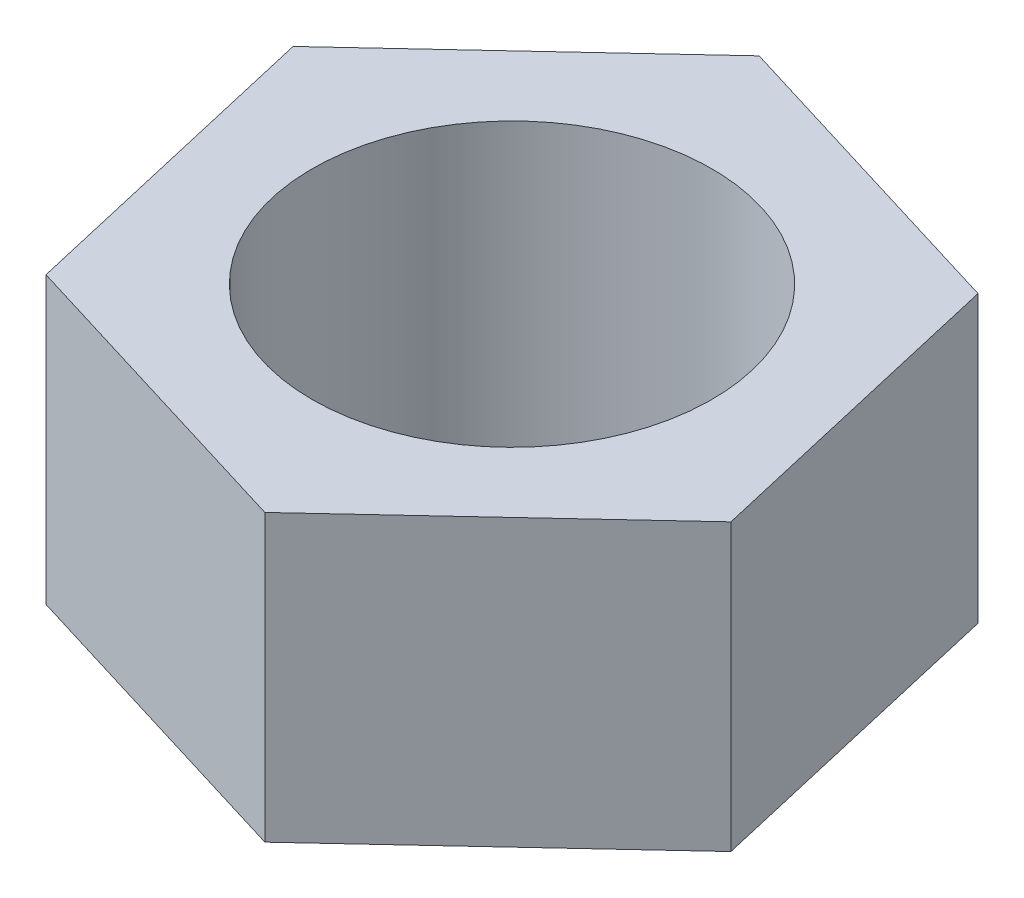
ISO-10303-21;
HEADER;
FILE_DESCRIPTION(('STEP AP214'),'2;1');
FILE_NAME('part.step','',(''),(''),'','','');
FILE_SCHEMA(('AUTOMOTIVE_DESIGN { 1 0 10303 214 1 1 1 1 }'));
ENDSEC;
DATA;
#1=APPLICATION_CONTEXT('core data for automotive mechanical design processes');
#2=APPLICATION_PROTOCOL_DEFINITION('international standard','automotive_design',2000,#1);
#3=PRODUCT_CONTEXT('',#1,'mechanical');
#4=PRODUCT('Part','Part','',(#3));
#5=PRODUCT_RELATED_PRODUCT_CATEGORY('part','',(#4));
#6=PRODUCT_DEFINITION_FORMATION('','',#4);
#7=PRODUCT_DEFINITION_CONTEXT('part definition',#1,'design');
#8=PRODUCT_DEFINITION('design','',#6,#7);
#9=PRODUCT_DEFINITION_SHAPE('','',#8);
#10=(LENGTH_UNIT() NAMED_UNIT(*) SI_UNIT(.MILLI.,.METRE.));
#11=(NAMED_UNIT(*) PLANE_ANGLE_UNIT() SI_UNIT($,.RADIAN.));
#12=(NAMED_UNIT(*) SI_UNIT($,.STERADIAN.) SOLID_ANGLE_UNIT());
#13=UNCERTAINTY_MEASURE_WITH_UNIT(LENGTH_MEASURE(1.E-05),#10,'distance_accuracy_value','');
#14=(GEOMETRIC_REPRESENTATION_CONTEXT(3) GLOBAL_UNCERTAINTY_ASSIGNED_CONTEXT((#13)) GLOBAL_UNIT_ASSIGNED_CONTEXT((#10,
#11,#12)) REPRESENTATION_CONTEXT('',''));
#15=CARTESIAN_POINT('',(0.,0.,0.));
#16=DIRECTION('',(0.,0.,1.));
#17=DIRECTION('',(1.,0.,0.));
#18=AXIS2_PLACEMENT_3D('',#15,#16,#17);
#19=CARTESIAN_POINT('',(2.59645393444764,10.,11.2513003826058));
#20=DIRECTION('',(0.,1.,0.));
#21=DIRECTION('',(0.,0.,1.));
#22=AXIS2_PLACEMENT_3D('',#19,#20,#21);
#23=PLANE('',#22);
#24=DIRECTION('',(0.956277282044818,0.,0.292461552763736));
#25=VECTOR('',#24,1.);
#26=CARTESIAN_POINT('',(-8.44568498972238,10.,7.87424525829061));
#27=LINE('',#26,#25);
#28=CARTESIAN_POINT('',(-8.44568498972238,10.,7.87424525829061));
#29=VERTEX_POINT('',#28);
#30=CARTESIAN_POINT('',(2.59645393444764,10.,11.2513003826058));
#31=VERTEX_POINT('',#30);
#32=EDGE_CURVE('E127',#29,#31,#27,.T.);
#33=ORIENTED_EDGE('',*,*,#32,.T.);
#34=DIRECTION('',(0.731417775346047,0.,-0.681929642930881));
#35=VECTOR('',#34,1.);
#36=CARTESIAN_POINT('',(2.59645393444764,10.,11.2513003826058));
#37=LINE('',#36,#35);
#38=CARTESIAN_POINT('',(11.04213892417,10.,3.37705512431518));
#39=VERTEX_POINT('',#38);
#40=EDGE_CURVE('E85',#31,#39,#37,.T.);
#41=ORIENTED_EDGE('',*,*,#40,.T.);
#42=DIRECTION('',(-0.224859506698771,0.,-0.974391195694617));
#43=VECTOR('',#42,1.);
#44=CARTESIAN_POINT('',(11.04213892417,10.,3.37705512431518));
#45=LINE('',#44,#43);
#46=CARTESIAN_POINT('',(8.44568498972238,10.,-7.87424525829062));
#47=VERTEX_POINT('',#46);
#48=EDGE_CURVE('E98',#39,#47,#45,.T.);
#49=ORIENTED_EDGE('',*,*,#48,.T.);
#50=DIRECTION('',(-0.956277282044818,0.,-0.292461552763736));
#51=VECTOR('',#50,1.);
#52=CARTESIAN_POINT('',(8.44568498972238,10.,-7.87424525829062));
#53=LINE('',#52,#51);
#54=CARTESIAN_POINT('',(-2.59645393444764,10.,-11.2513003826058));
#55=VERTEX_POINT('',#54);
#56=EDGE_CURVE('E92',#47,#55,#53,.T.);
#57=ORIENTED_EDGE('',*,*,#56,.T.);
#58=DIRECTION('',(-0.731417775346047,0.,0.681929642930881));
#59=VECTOR('',#58,1.);
#60=CARTESIAN_POINT('',(-2.59645393444764,10.,-11.2513003826058));
#61=LINE('',#60,#59);
#62=CARTESIAN_POINT('',(-11.04213892417,10.,-3.37705512431519));
#63=VERTEX_POINT('',#62);
#64=EDGE_CURVE('E96',#55,#63,#61,.T.);
#65=ORIENTED_EDGE('',*,*,#64,.T.);
#66=DIRECTION('',(0.224859506698771,0.,0.974391195694617));
#67=VECTOR('',#66,1.);
#68=CARTESIAN_POINT('',(-11.04213892417,10.,-3.37705512431519));
#69=LINE('',#68,#67);
#70=EDGE_CURVE('E48',#63,#29,#69,.T.);
#71=ORIENTED_EDGE('',*,*,#70,.T.);
#72=EDGE_LOOP('',(#33,#41,#49,#57,#65,#71));
#73=FACE_BOUND('',#72,.T.);
#74=CARTESIAN_POINT('',(0.,10.,0.));
#75=DIRECTION('',(0.,1.,0.));
#76=DIRECTION('',(0.,0.,1.));
#77=AXIS2_PLACEMENT_3D('',#74,#75,#76);
#78=CIRCLE('',#77,7.);
#79=CARTESIAN_POINT('',(0.,10.,7.));
#80=VERTEX_POINT('',#79);
#81=EDGE_CURVE('E120',#80,#80,#78,.T.);
#82=ORIENTED_EDGE('',*,*,#81,.F.);
#83=EDGE_LOOP('',(#82));
#84=FACE_BOUND('',#83,.T.);
#85=ADVANCED_FACE('F31',(#73,#84),#23,.T.);
#86=CARTESIAN_POINT('',(2.59645393444764,0.,11.2513003826058));
#87=DIRECTION('',(0.,1.,0.));
#88=DIRECTION('',(0.,0.,1.));
#89=AXIS2_PLACEMENT_3D('',#86,#87,#88);
#90=PLANE('',#89);
#91=DIRECTION('',(0.956277282044818,0.,0.292461552763736));
#92=VECTOR('',#91,1.);
#93=CARTESIAN_POINT('',(-8.44568498972238,0.,7.87424525829061));
#94=LINE('',#93,#92);
#95=CARTESIAN_POINT('',(-8.44568498972238,0.,7.87424525829061));
#96=VERTEX_POINT('',#95);
#97=CARTESIAN_POINT('',(2.59645393444764,0.,11.2513003826058));
#98=VERTEX_POINT('',#97);
#99=EDGE_CURVE('E116',#96,#98,#94,.T.);
#100=ORIENTED_EDGE('',*,*,#99,.F.);
#101=DIRECTION('',(0.224859506698771,0.,0.974391195694617));
#102=VECTOR('',#101,1.);
#103=CARTESIAN_POINT('',(-11.04213892417,0.,-3.37705512431519));
#104=LINE('',#103,#102);
#105=CARTESIAN_POINT('',(-11.04213892417,0.,-3.37705512431519));
#106=VERTEX_POINT('',#105);
#107=EDGE_CURVE('E77',#106,#96,#104,.T.);
#108=ORIENTED_EDGE('',*,*,#107,.F.);
#109=DIRECTION('',(-0.731417775346047,0.,0.681929642930881));
#110=VECTOR('',#109,1.);
#111=CARTESIAN_POINT('',(-2.59645393444764,0.,-11.2513003826058));
#112=LINE('',#111,#110);
#113=CARTESIAN_POINT('',(-2.59645393444764,0.,-11.2513003826058));
#114=VERTEX_POINT('',#113);
#115=EDGE_CURVE('E71',#114,#106,#112,.T.);
#116=ORIENTED_EDGE('',*,*,#115,.F.);
#117=DIRECTION('',(-0.956277282044818,0.,-0.292461552763736));
#118=VECTOR('',#117,1.);
#119=CARTESIAN_POINT('',(8.44568498972238,0.,-7.87424525829062));
#120=LINE('',#119,#118);
#121=CARTESIAN_POINT('',(8.44568498972238,0.,-7.87424525829062));
#122=VERTEX_POINT('',#121);
#123=EDGE_CURVE('E106',#122,#114,#120,.T.);
#124=ORIENTED_EDGE('',*,*,#123,.F.);
#125=DIRECTION('',(-0.224859506698771,0.,-0.974391195694617));
#126=VECTOR('',#125,1.);
#127=CARTESIAN_POINT('',(11.04213892417,0.,3.37705512431518));
#128=LINE('',#127,#126);
#129=CARTESIAN_POINT('',(11.04213892417,0.,3.37705512431518));
#130=VERTEX_POINT('',#129);
#131=EDGE_CURVE('E122',#130,#122,#128,.T.);
#132=ORIENTED_EDGE('',*,*,#131,.F.);
#133=DIRECTION('',(0.731417775346047,0.,-0.681929642930881));
#134=VECTOR('',#133,1.);
#135=CARTESIAN_POINT('',(2.59645393444764,0.,11.2513003826058));
#136=LINE('',#135,#134);
#137=EDGE_CURVE('E119',#98,#130,#136,.T.);
#138=ORIENTED_EDGE('',*,*,#137,.F.);
#139=EDGE_LOOP('',(#100,#108,#116,#124,#132,#138));
#140=FACE_BOUND('',#139,.T.);
#141=CARTESIAN_POINT('',(0.,0.,0.));
#142=DIRECTION('',(0.,1.,0.));
#143=DIRECTION('',(0.,0.,1.));
#144=AXIS2_PLACEMENT_3D('',#141,#142,#143);
#145=CIRCLE('',#144,7.);
#146=CARTESIAN_POINT('',(0.,0.,7.));
#147=VERTEX_POINT('',#146);
#148=EDGE_CURVE('E220',#147,#147,#145,.T.);
#149=ORIENTED_EDGE('',*,*,#148,.T.);
#150=EDGE_LOOP('',(#149));
#151=FACE_BOUND('',#150,.T.);
#152=ADVANCED_FACE('F136',(#140,#151),#90,.F.);
#153=CARTESIAN_POINT('',(-8.44568498972238,10.,7.87424525829061));
#154=DIRECTION('',(0.292461552763736,0.,-0.956277282044818));
#155=DIRECTION('',(-0.956277282044818,0.,-0.292461552763736));
#156=AXIS2_PLACEMENT_3D('',#153,#154,#155);
#157=PLANE('',#156);
#158=ORIENTED_EDGE('',*,*,#99,.T.);
#159=DIRECTION('',(0.,-1.,0.));
#160=VECTOR('',#159,1.);
#161=CARTESIAN_POINT('',(2.59645393444764,10.,11.2513003826058));
#162=LINE('',#161,#160);
#163=EDGE_CURVE('E11',#31,#98,#162,.T.);
#164=ORIENTED_EDGE('',*,*,#163,.F.);
#165=ORIENTED_EDGE('',*,*,#32,.F.);
#166=DIRECTION('',(0.,-1.,0.));
#167=VECTOR('',#166,1.);
#168=CARTESIAN_POINT('',(-8.44568498972238,10.,7.87424525829061));
#169=LINE('',#168,#167);
#170=EDGE_CURVE('E112',#29,#96,#169,.T.);
#171=ORIENTED_EDGE('',*,*,#170,.T.);
#172=EDGE_LOOP('',(#158,#164,#165,#171));
#173=FACE_BOUND('',#172,.T.);
#174=ADVANCED_FACE('F33',(#173),#157,.F.);
#175=CARTESIAN_POINT('',(2.59645393444764,10.,11.2513003826058));
#176=DIRECTION('',(-0.681929642930881,0.,-0.731417775346047));
#177=DIRECTION('',(-0.731417775346047,0.,0.681929642930881));
#178=AXIS2_PLACEMENT_3D('',#175,#176,#177);
#179=PLANE('',#178);
#180=ORIENTED_EDGE('',*,*,#137,.T.);
#181=DIRECTION('',(0.,-1.,0.));
#182=VECTOR('',#181,1.);
#183=CARTESIAN_POINT('',(11.04213892417,10.,3.37705512431518));
#184=LINE('',#183,#182);
#185=EDGE_CURVE('E40',#39,#130,#184,.T.);
#186=ORIENTED_EDGE('',*,*,#185,.F.);
#187=ORIENTED_EDGE('',*,*,#40,.F.);
#188=ORIENTED_EDGE('',*,*,#163,.T.);
#189=EDGE_LOOP('',(#180,#186,#187,#188));
#190=FACE_BOUND('',#189,.T.);
#191=ADVANCED_FACE('F161',(#190),#179,.F.);
#192=CARTESIAN_POINT('',(11.04213892417,10.,3.37705512431518));
#193=DIRECTION('',(-0.974391195694617,0.,0.224859506698771));
#194=DIRECTION('',(0.224859506698771,0.,0.974391195694617));
#195=AXIS2_PLACEMENT_3D('',#192,#193,#194);
#196=PLANE('',#195);
#197=ORIENTED_EDGE('',*,*,#131,.T.);
#198=DIRECTION('',(0.,-1.,0.));
#199=VECTOR('',#198,1.);
#200=CARTESIAN_POINT('',(8.44568498972238,10.,-7.87424525829062));
#201=LINE('',#200,#199);
#202=EDGE_CURVE('E107',#47,#122,#201,.T.);
#203=ORIENTED_EDGE('',*,*,#202,.F.);
#204=ORIENTED_EDGE('',*,*,#48,.F.);
#205=ORIENTED_EDGE('',*,*,#185,.T.);
#206=EDGE_LOOP('',(#197,#203,#204,#205));
#207=FACE_BOUND('',#206,.T.);
#208=ADVANCED_FACE('F133',(#207),#196,.F.);
#209=CARTESIAN_POINT('',(8.44568498972238,10.,-7.87424525829062));
#210=DIRECTION('',(-0.292461552763736,0.,0.956277282044818));
#211=DIRECTION('',(0.956277282044818,0.,0.292461552763736));
#212=AXIS2_PLACEMENT_3D('',#209,#210,#211);
#213=PLANE('',#212);
#214=ORIENTED_EDGE('',*,*,#123,.T.);
#215=DIRECTION('',(0.,-1.,0.));
#216=VECTOR('',#215,1.);
#217=CARTESIAN_POINT('',(-2.59645393444764,10.,-11.2513003826058));
#218=LINE('',#217,#216);
#219=EDGE_CURVE('E103',#55,#114,#218,.T.);
#220=ORIENTED_EDGE('',*,*,#219,.F.);
#221=ORIENTED_EDGE('',*,*,#56,.F.);
#222=ORIENTED_EDGE('',*,*,#202,.T.);
#223=EDGE_LOOP('',(#214,#220,#221,#222));
#224=FACE_BOUND('',#223,.T.);
#225=ADVANCED_FACE('F104',(#224),#213,.F.);
#226=CARTESIAN_POINT('',(-2.59645393444764,10.,-11.2513003826058));
#227=DIRECTION('',(0.681929642930881,0.,0.731417775346047));
#228=DIRECTION('',(0.731417775346047,0.,-0.681929642930881));
#229=AXIS2_PLACEMENT_3D('',#226,#227,#228);
#230=PLANE('',#229);
#231=ORIENTED_EDGE('',*,*,#115,.T.);
#232=DIRECTION('',(0.,-1.,0.));
#233=VECTOR('',#232,1.);
#234=CARTESIAN_POINT('',(-11.04213892417,10.,-3.37705512431519));
#235=LINE('',#234,#233);
#236=EDGE_CURVE('E108',#63,#106,#235,.T.);
#237=ORIENTED_EDGE('',*,*,#236,.F.);
#238=ORIENTED_EDGE('',*,*,#64,.F.);
#239=ORIENTED_EDGE('',*,*,#219,.T.);
#240=EDGE_LOOP('',(#231,#237,#238,#239));
#241=FACE_BOUND('',#240,.T.);
#242=ADVANCED_FACE('F110',(#241),#230,.F.);
#243=CARTESIAN_POINT('',(-11.04213892417,10.,-3.37705512431519));
#244=DIRECTION('',(0.974391195694617,0.,-0.224859506698771));
#245=DIRECTION('',(-0.224859506698771,0.,-0.974391195694617));
#246=AXIS2_PLACEMENT_3D('',#243,#244,#245);
#247=PLANE('',#246);
#248=ORIENTED_EDGE('',*,*,#107,.T.);
#249=ORIENTED_EDGE('',*,*,#170,.F.);
#250=ORIENTED_EDGE('',*,*,#70,.F.);
#251=ORIENTED_EDGE('',*,*,#236,.T.);
#252=EDGE_LOOP('',(#248,#249,#250,#251));
#253=FACE_BOUND('',#252,.T.);
#254=ADVANCED_FACE('F141',(#253),#247,.F.);
#255=CARTESIAN_POINT('',(0.,10.,0.));
#256=DIRECTION('',(0.,-1.,0.));
#257=DIRECTION('',(0.,0.,-1.));
#258=AXIS2_PLACEMENT_3D('',#255,#256,#257);
#259=CYLINDRICAL_SURFACE('',#258,7.);
#260=ORIENTED_EDGE('',*,*,#81,.T.);
#261=EDGE_LOOP('',(#260));
#262=FACE_BOUND('',#261,.T.);
#263=ORIENTED_EDGE('',*,*,#148,.F.);
#264=EDGE_LOOP('',(#263));
#265=FACE_BOUND('',#264,.T.);
#266=ADVANCED_FACE('F143',(#262,#265),#259,.F.);
#267=CLOSED_SHELL('',(#85,#152,#174,#191,#208,#225,#242,#254,#266));
#268=MANIFOLD_SOLID_BREP('B2',#267);
#269=ADVANCED_BREP_SHAPE_REPRESENTATION('',(#18,#268),#14);
#270=SHAPE_DEFINITION_REPRESENTATION(#9,#269);
ENDSEC;
END-ISO-10303-21;
